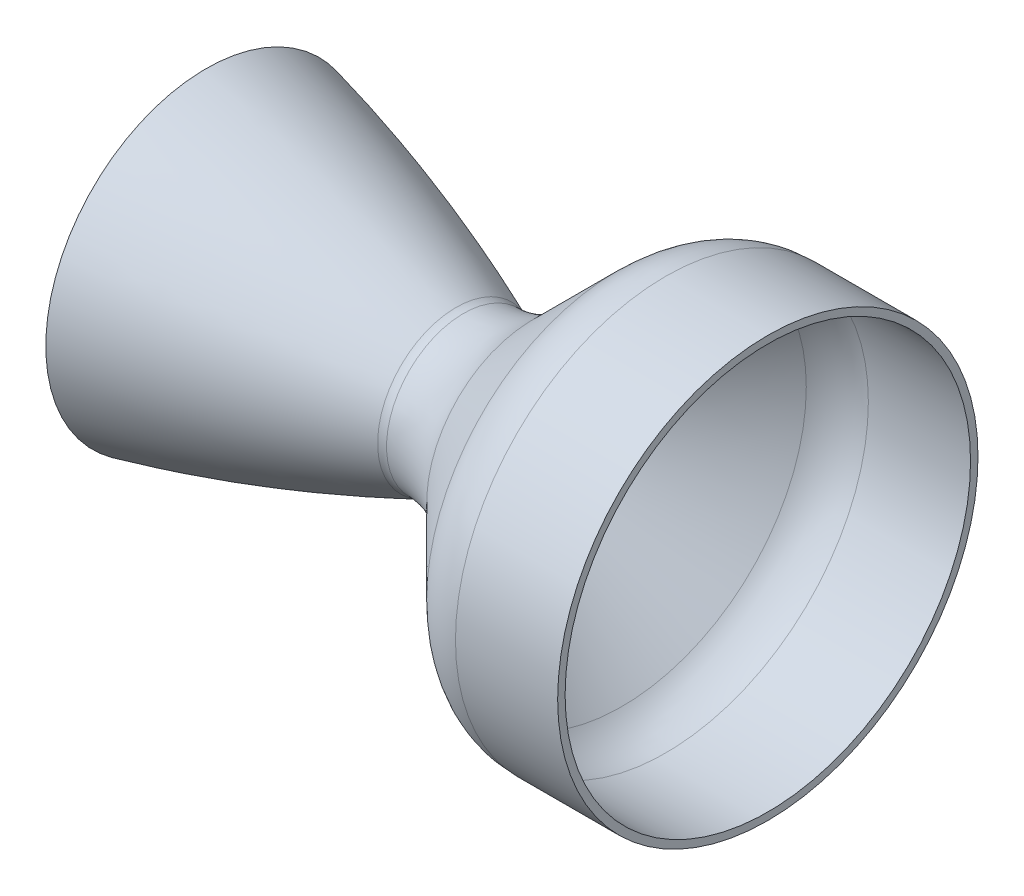
ISO-10303-21;
HEADER;
FILE_DESCRIPTION(('STEP AP214'),'2;1');
FILE_NAME('part.step','',(''),(''),'','','');
FILE_SCHEMA(('AUTOMOTIVE_DESIGN { 1 0 10303 214 1 1 1 1 }'));
ENDSEC;
DATA;
#1=APPLICATION_CONTEXT('core data for automotive mechanical design processes');
#2=APPLICATION_PROTOCOL_DEFINITION('international standard','automotive_design',2000,#1);
#3=PRODUCT_CONTEXT('',#1,'mechanical');
#4=PRODUCT('Part','Part','',(#3));
#5=PRODUCT_RELATED_PRODUCT_CATEGORY('part','',(#4));
#6=PRODUCT_DEFINITION_FORMATION('','',#4);
#7=PRODUCT_DEFINITION_CONTEXT('part definition',#1,'design');
#8=PRODUCT_DEFINITION('design','',#6,#7);
#9=PRODUCT_DEFINITION_SHAPE('','',#8);
#10=(LENGTH_UNIT() NAMED_UNIT(*) SI_UNIT(.MILLI.,.METRE.));
#11=(NAMED_UNIT(*) PLANE_ANGLE_UNIT() SI_UNIT($,.RADIAN.));
#12=(NAMED_UNIT(*) SI_UNIT($,.STERADIAN.) SOLID_ANGLE_UNIT());
#13=UNCERTAINTY_MEASURE_WITH_UNIT(LENGTH_MEASURE(1.E-05),#10,'distance_accuracy_value','');
#14=(GEOMETRIC_REPRESENTATION_CONTEXT(3) GLOBAL_UNCERTAINTY_ASSIGNED_CONTEXT((#13)) GLOBAL_UNIT_ASSIGNED_CONTEXT((#10,
#11,#12)) REPRESENTATION_CONTEXT('',''));
#15=CARTESIAN_POINT('',(0.,0.,0.));
#16=DIRECTION('',(0.,0.,1.));
#17=DIRECTION('',(1.,0.,0.));
#18=AXIS2_PLACEMENT_3D('',#15,#16,#17);
#19=CARTESIAN_POINT('',(1.66197017655065,0.,0.));
#20=DIRECTION('',(1.,0.,0.));
#21=DIRECTION('',(0.,0.,-1.));
#22=AXIS2_PLACEMENT_3D('',#19,#20,#21);
#23=TOROIDAL_SURFACE('',#22,15.4784,3.0784);
#24=CARTESIAN_POINT('',(1.66197017655065,0.,0.));
#25=DIRECTION('',(1.,0.,0.));
#26=DIRECTION('',(0.,0.,-1.));
#27=AXIS2_PLACEMENT_3D('',#24,#25,#26);
#28=CIRCLE('',#27,12.4000000000001);
#29=CARTESIAN_POINT('',(1.66197017655065,0.,-12.4000000000001));
#30=VERTEX_POINT('',#29);
#31=EDGE_CURVE('E100',#30,#30,#28,.T.);
#32=ORIENTED_EDGE('',*,*,#31,.F.);
#33=EDGE_LOOP('',(#32));
#34=FACE_BOUND('',#33,.T.);
#35=CARTESIAN_POINT('',(0.466147207334699,0.,0.));
#36=DIRECTION('',(1.,0.,0.));
#37=DIRECTION('',(0.,0.,-1.));
#38=AXIS2_PLACEMENT_3D('',#35,#36,#37);
#39=CIRCLE('',#38,12.6417551533025);
#40=CARTESIAN_POINT('',(0.466147207334699,0.,-12.6417551533025));
#41=VERTEX_POINT('',#40);
#42=EDGE_CURVE('E10',#41,#41,#39,.T.);
#43=ORIENTED_EDGE('',*,*,#42,.T.);
#44=EDGE_LOOP('',(#43));
#45=FACE_BOUND('',#44,.T.);
#46=ADVANCED_FACE('F41',(#34,#45),#23,.F.);
#47=CARTESIAN_POINT('',(0.4661472073347,12.6417551533025,0.));
#48=CARTESIAN_POINT('',(-19.5591653940373,21.0840712137456,0.));
#49=CARTESIAN_POINT('',(-39.8247227345233,25.7986104005006,0.));
#50=B_SPLINE_CURVE_WITH_KNOTS('',2,(#47,#48,#49),.UNSPECIFIED.,.F.,.F.,(3,3),(0.,1.),.UNSPECIFIED.);
#51=CARTESIAN_POINT('',(0.,0.,0.));
#52=DIRECTION('',(1.,0.,0.));
#53=AXIS1_PLACEMENT('',#51,#52);
#54=SURFACE_OF_REVOLUTION('',#50,#53);
#55=CARTESIAN_POINT('',(-39.8247227345233,0.,0.));
#56=DIRECTION('',(1.,0.,0.));
#57=DIRECTION('',(0.,0.,-1.));
#58=AXIS2_PLACEMENT_3D('',#55,#56,#57);
#59=CIRCLE('',#58,25.7986104005007);
#60=CARTESIAN_POINT('',(-39.8247227345233,0.,-25.7986104005007));
#61=VERTEX_POINT('',#60);
#62=EDGE_CURVE('E48',#61,#61,#59,.T.);
#63=ORIENTED_EDGE('',*,*,#62,.T.);
#64=EDGE_LOOP('',(#63));
#65=FACE_BOUND('',#64,.T.);
#66=ORIENTED_EDGE('',*,*,#42,.F.);
#67=EDGE_LOOP('',(#66));
#68=FACE_BOUND('',#67,.T.);
#69=ADVANCED_FACE('F124',(#65,#68),#54,.F.);
#70=CARTESIAN_POINT('',(-40.0966047493326,0.,0.));
#71=DIRECTION('',(1.,0.,0.));
#72=DIRECTION('',(0.,0.,-1.));
#73=AXIS2_PLACEMENT_3D('',#70,#71,#72);
#74=CONICAL_SURFACE('',#73,24.629816077267,1.34224337238869);
#75=ORIENTED_EDGE('',*,*,#62,.F.);
#76=EDGE_LOOP('',(#75));
#77=FACE_BOUND('',#76,.T.);
#78=CARTESIAN_POINT('',(-40.0966047493326,0.,0.));
#79=DIRECTION('',(1.,0.,0.));
#80=DIRECTION('',(0.,0.,-1.));
#81=AXIS2_PLACEMENT_3D('',#78,#79,#80);
#82=CIRCLE('',#81,24.629816077267);
#83=CARTESIAN_POINT('',(-40.0966047493326,0.,-24.629816077267));
#84=VERTEX_POINT('',#83);
#85=EDGE_CURVE('E53',#84,#84,#82,.T.);
#86=ORIENTED_EDGE('',*,*,#85,.T.);
#87=EDGE_LOOP('',(#86));
#88=FACE_BOUND('',#87,.T.);
#89=ADVANCED_FACE('F120',(#77,#88),#74,.T.);
#90=CARTESIAN_POINT('',(0.,11.5359944282385,0.));
#91=CARTESIAN_POINT('',(-19.9351691874844,19.9399133176101,0.));
#92=CARTESIAN_POINT('',(-40.0966047493326,24.629816077267,0.));
#93=B_SPLINE_CURVE_WITH_KNOTS('',2,(#90,#91,#92),.UNSPECIFIED.,.F.,.F.,(3,3),(0.,1.),.UNSPECIFIED.);
#94=CARTESIAN_POINT('',(0.,0.,0.));
#95=DIRECTION('',(1.,0.,0.));
#96=AXIS1_PLACEMENT('',#94,#95);
#97=SURFACE_OF_REVOLUTION('',#93,#96);
#98=ORIENTED_EDGE('',*,*,#85,.F.);
#99=EDGE_LOOP('',(#98));
#100=FACE_BOUND('',#99,.T.);
#101=CARTESIAN_POINT('',(0.,0.,0.));
#102=DIRECTION('',(1.,0.,0.));
#103=DIRECTION('',(0.,0.,-1.));
#104=AXIS2_PLACEMENT_3D('',#101,#102,#103);
#105=CIRCLE('',#104,11.5359944282385);
#106=CARTESIAN_POINT('',(0.,0.,-11.5359944282385));
#107=VERTEX_POINT('',#106);
#108=EDGE_CURVE('E58',#107,#107,#105,.T.);
#109=ORIENTED_EDGE('',*,*,#108,.T.);
#110=EDGE_LOOP('',(#109));
#111=FACE_BOUND('',#110,.T.);
#112=ADVANCED_FACE('F115',(#100,#111),#97,.T.);
#113=CARTESIAN_POINT('',(1.66197017655065,0.,0.));
#114=DIRECTION('',(1.,0.,0.));
#115=DIRECTION('',(0.,0.,-1.));
#116=AXIS2_PLACEMENT_3D('',#113,#114,#115);
#117=TOROIDAL_SURFACE('',#116,15.4784,4.2784);
#118=ORIENTED_EDGE('',*,*,#108,.F.);
#119=EDGE_LOOP('',(#118));
#120=FACE_BOUND('',#119,.T.);
#121=CARTESIAN_POINT('',(1.66197017655065,0.,0.));
#122=DIRECTION('',(1.,0.,0.));
#123=DIRECTION('',(0.,0.,-1.));
#124=AXIS2_PLACEMENT_3D('',#121,#122,#123);
#125=CIRCLE('',#124,11.2000000000001);
#126=CARTESIAN_POINT('',(1.66197017655065,0.,-11.2000000000001));
#127=VERTEX_POINT('',#126);
#128=EDGE_CURVE('E64',#127,#127,#125,.T.);
#129=ORIENTED_EDGE('',*,*,#128,.T.);
#130=EDGE_LOOP('',(#129));
#131=FACE_BOUND('',#130,.T.);
#132=ADVANCED_FACE('F119',(#120,#131),#117,.T.);
#133=CARTESIAN_POINT('',(1.66197017655065,0.,0.));
#134=DIRECTION('',(1.,0.,0.));
#135=DIRECTION('',(0.,0.,-1.));
#136=AXIS2_PLACEMENT_3D('',#133,#134,#135);
#137=TOROIDAL_SURFACE('',#136,28.,16.7999999999999);
#138=ORIENTED_EDGE('',*,*,#128,.F.);
#139=EDGE_LOOP('',(#138));
#140=FACE_BOUND('',#139,.T.);
#141=CARTESIAN_POINT('',(13.5413641004845,0.,0.));
#142=DIRECTION('',(1.,0.,0.));
#143=DIRECTION('',(0.,0.,-1.));
#144=AXIS2_PLACEMENT_3D('',#141,#142,#143);
#145=CIRCLE('',#144,16.1206060760662);
#146=CARTESIAN_POINT('',(13.5413641004845,0.,-16.1206060760662));
#147=VERTEX_POINT('',#146);
#148=EDGE_CURVE('E68',#147,#147,#145,.T.);
#149=ORIENTED_EDGE('',*,*,#148,.T.);
#150=EDGE_LOOP('',(#149));
#151=FACE_BOUND('',#150,.T.);
#152=ADVANCED_FACE('F180',(#140,#151),#137,.T.);
#153=CARTESIAN_POINT('',(27.1451564474174,0.,0.));
#154=DIRECTION('',(1.,0.,0.));
#155=DIRECTION('',(0.,0.,-1.));
#156=AXIS2_PLACEMENT_3D('',#153,#154,#155);
#157=CONICAL_SURFACE('',#156,29.7243984229992,0.78539816339745);
#158=ORIENTED_EDGE('',*,*,#148,.F.);
#159=EDGE_LOOP('',(#158));
#160=FACE_BOUND('',#159,.T.);
#161=CARTESIAN_POINT('',(27.1451564474174,0.,0.));
#162=DIRECTION('',(1.,0.,0.));
#163=DIRECTION('',(0.,0.,-1.));
#164=AXIS2_PLACEMENT_3D('',#161,#162,#163);
#165=CIRCLE('',#164,29.7243984229992);
#166=CARTESIAN_POINT('',(27.1451564474174,0.,-29.7243984229992));
#167=VERTEX_POINT('',#166);
#168=EDGE_CURVE('E72',#167,#167,#165,.T.);
#169=ORIENTED_EDGE('',*,*,#168,.T.);
#170=EDGE_LOOP('',(#169));
#171=FACE_BOUND('',#170,.T.);
#172=ADVANCED_FACE('F174',(#160,#171),#157,.F.);
#173=CARTESIAN_POINT('',(34.2162242592828,0.,0.));
#174=DIRECTION('',(1.,0.,0.));
#175=DIRECTION('',(0.,0.,-1.));
#176=AXIS2_PLACEMENT_3D('',#173,#174,#175);
#177=TOROIDAL_SURFACE('',#176,22.6533306111337,10.);
#178=ORIENTED_EDGE('',*,*,#168,.F.);
#179=EDGE_LOOP('',(#178));
#180=FACE_BOUND('',#179,.T.);
#181=CARTESIAN_POINT('',(34.2162242592828,0.,0.));
#182=DIRECTION('',(1.,0.,0.));
#183=DIRECTION('',(0.,0.,-1.));
#184=AXIS2_PLACEMENT_3D('',#181,#182,#183);
#185=CIRCLE('',#184,32.6533306111337);
#186=CARTESIAN_POINT('',(34.2162242592828,0.,-32.6533306111337));
#187=VERTEX_POINT('',#186);
#188=EDGE_CURVE('E76',#187,#187,#185,.T.);
#189=ORIENTED_EDGE('',*,*,#188,.T.);
#190=EDGE_LOOP('',(#189));
#191=FACE_BOUND('',#190,.T.);
#192=ADVANCED_FACE('F168',(#180,#191),#177,.F.);
#193=CARTESIAN_POINT('',(0.,0.,0.));
#194=DIRECTION('',(1.,0.,0.));
#195=DIRECTION('',(0.,0.,-1.));
#196=AXIS2_PLACEMENT_3D('',#193,#194,#195);
#197=CYLINDRICAL_SURFACE('',#196,32.6533306111337);
#198=ORIENTED_EDGE('',*,*,#188,.F.);
#199=EDGE_LOOP('',(#198));
#200=FACE_BOUND('',#199,.T.);
#201=CARTESIAN_POINT('',(50.6745682121233,0.,0.));
#202=DIRECTION('',(1.,0.,0.));
#203=DIRECTION('',(0.,0.,-1.));
#204=AXIS2_PLACEMENT_3D('',#201,#202,#203);
#205=CIRCLE('',#204,32.6533306111337);
#206=CARTESIAN_POINT('',(50.6745682121233,0.,-32.6533306111337));
#207=VERTEX_POINT('',#206);
#208=EDGE_CURVE('E80',#207,#207,#205,.T.);
#209=ORIENTED_EDGE('',*,*,#208,.T.);
#210=EDGE_LOOP('',(#209));
#211=FACE_BOUND('',#210,.T.);
#212=ADVANCED_FACE('F163',(#200,#211),#197,.F.);
#213=CARTESIAN_POINT('',(50.6745682121233,0.,0.));
#214=DIRECTION('',(1.,0.,0.));
#215=DIRECTION('',(0.,0.,-1.));
#216=AXIS2_PLACEMENT_3D('',#213,#214,#215);
#217=PLANE('',#216);
#218=CARTESIAN_POINT('',(50.6745682121233,0.,0.));
#219=DIRECTION('',(1.,0.,0.));
#220=DIRECTION('',(0.,0.,-1.));
#221=AXIS2_PLACEMENT_3D('',#218,#219,#220);
#222=CIRCLE('',#221,33.8533306111337);
#223=CARTESIAN_POINT('',(50.6745682121233,0.,-33.8533306111337));
#224=VERTEX_POINT('',#223);
#225=EDGE_CURVE('E84',#224,#224,#222,.T.);
#226=ORIENTED_EDGE('',*,*,#225,.T.);
#227=EDGE_LOOP('',(#226));
#228=FACE_BOUND('',#227,.T.);
#229=ORIENTED_EDGE('',*,*,#208,.F.);
#230=EDGE_LOOP('',(#229));
#231=FACE_BOUND('',#230,.T.);
#232=ADVANCED_FACE('F157',(#228,#231),#217,.T.);
#233=CARTESIAN_POINT('',(0.,0.,0.));
#234=DIRECTION('',(1.,0.,0.));
#235=DIRECTION('',(0.,0.,-1.));
#236=AXIS2_PLACEMENT_3D('',#233,#234,#235);
#237=CYLINDRICAL_SURFACE('',#236,33.8533306111337);
#238=CARTESIAN_POINT('',(34.2162242592828,0.,0.));
#239=DIRECTION('',(1.,0.,0.));
#240=DIRECTION('',(0.,0.,-1.));
#241=AXIS2_PLACEMENT_3D('',#238,#239,#240);
#242=CIRCLE('',#241,33.8533306111337);
#243=CARTESIAN_POINT('',(34.2162242592828,0.,-33.8533306111337));
#244=VERTEX_POINT('',#243);
#245=EDGE_CURVE('E88',#244,#244,#242,.T.);
#246=ORIENTED_EDGE('',*,*,#245,.T.);
#247=EDGE_LOOP('',(#246));
#248=FACE_BOUND('',#247,.T.);
#249=ORIENTED_EDGE('',*,*,#225,.F.);
#250=EDGE_LOOP('',(#249));
#251=FACE_BOUND('',#250,.T.);
#252=ADVANCED_FACE('F151',(#248,#251),#237,.T.);
#253=CARTESIAN_POINT('',(34.2162242592828,0.,0.));
#254=DIRECTION('',(1.,0.,0.));
#255=DIRECTION('',(0.,0.,-1.));
#256=AXIS2_PLACEMENT_3D('',#253,#254,#255);
#257=TOROIDAL_SURFACE('',#256,22.6533306111337,11.2);
#258=CARTESIAN_POINT('',(26.2966283099936,0.,0.));
#259=DIRECTION('',(1.,0.,0.));
#260=DIRECTION('',(0.,0.,-1.));
#261=AXIS2_PLACEMENT_3D('',#258,#259,#260);
#262=CIRCLE('',#261,30.5729265604231);
#263=CARTESIAN_POINT('',(26.2966283099936,0.,-30.5729265604231));
#264=VERTEX_POINT('',#263);
#265=EDGE_CURVE('E92',#264,#264,#262,.T.);
#266=ORIENTED_EDGE('',*,*,#265,.T.);
#267=EDGE_LOOP('',(#266));
#268=FACE_BOUND('',#267,.T.);
#269=ORIENTED_EDGE('',*,*,#245,.F.);
#270=EDGE_LOOP('',(#269));
#271=FACE_BOUND('',#270,.T.);
#272=ADVANCED_FACE('F145',(#268,#271),#257,.T.);
#273=CARTESIAN_POINT('',(26.2966283099936,0.,0.));
#274=DIRECTION('',(1.,0.,0.));
#275=DIRECTION('',(0.,0.,-1.));
#276=AXIS2_PLACEMENT_3D('',#273,#274,#275);
#277=CONICAL_SURFACE('',#276,30.5729265604231,0.785398163397451);
#278=CARTESIAN_POINT('',(12.6928359630606,0.,0.));
#279=DIRECTION('',(1.,0.,0.));
#280=DIRECTION('',(0.,0.,-1.));
#281=AXIS2_PLACEMENT_3D('',#278,#279,#280);
#282=CIRCLE('',#281,16.9691342134901);
#283=CARTESIAN_POINT('',(12.6928359630606,0.,-16.9691342134901));
#284=VERTEX_POINT('',#283);
#285=EDGE_CURVE('E96',#284,#284,#282,.T.);
#286=ORIENTED_EDGE('',*,*,#285,.T.);
#287=EDGE_LOOP('',(#286));
#288=FACE_BOUND('',#287,.T.);
#289=ORIENTED_EDGE('',*,*,#265,.F.);
#290=EDGE_LOOP('',(#289));
#291=FACE_BOUND('',#290,.T.);
#292=ADVANCED_FACE('F139',(#288,#291),#277,.T.);
#293=CARTESIAN_POINT('',(1.66197017655065,0.,0.));
#294=DIRECTION('',(1.,0.,0.));
#295=DIRECTION('',(0.,0.,-1.));
#296=AXIS2_PLACEMENT_3D('',#293,#294,#295);
#297=TOROIDAL_SURFACE('',#296,28.,15.5999999999999);
#298=ORIENTED_EDGE('',*,*,#31,.T.);
#299=EDGE_LOOP('',(#298));
#300=FACE_BOUND('',#299,.T.);
#301=ORIENTED_EDGE('',*,*,#285,.F.);
#302=EDGE_LOOP('',(#301));
#303=FACE_BOUND('',#302,.T.);
#304=ADVANCED_FACE('F136',(#300,#303),#297,.F.);
#305=CLOSED_SHELL('',(#46,#69,#89,#112,#132,#152,#172,#192,#212,#232,#252,#272,#292,#304));
#306=MANIFOLD_SOLID_BREP('B2',#305);
#307=ADVANCED_BREP_SHAPE_REPRESENTATION('',(#18,#306),#14);
#308=SHAPE_DEFINITION_REPRESENTATION(#9,#307);
ENDSEC;
END-ISO-10303-21;
